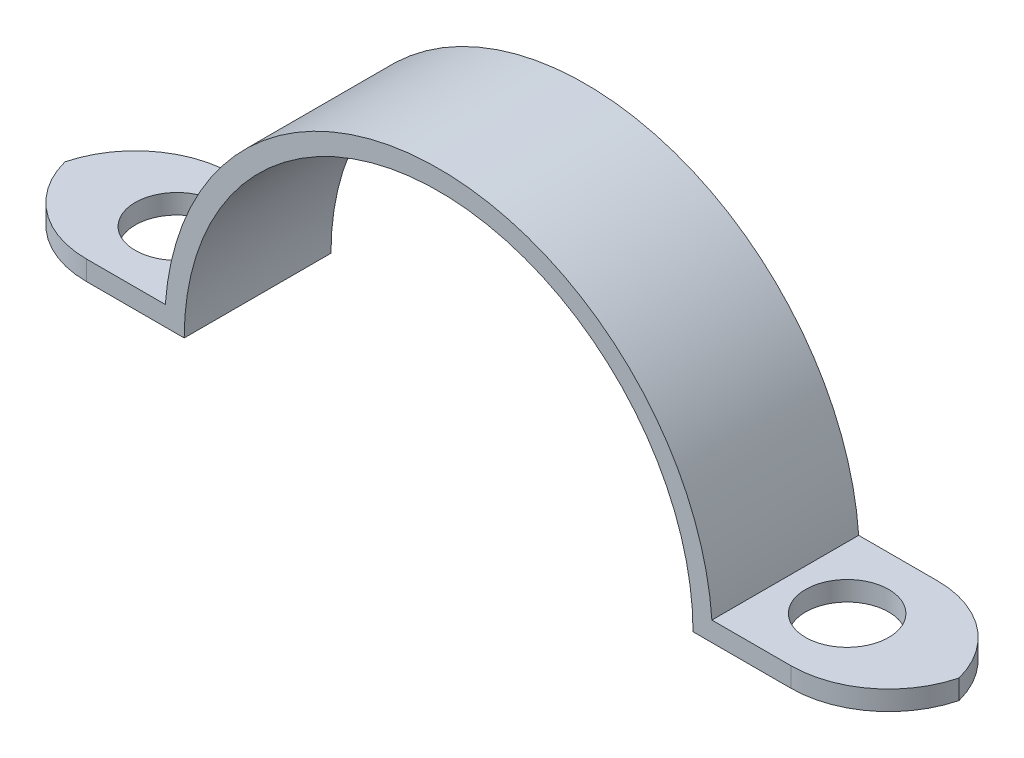
ISO-10303-21;
HEADER;
FILE_DESCRIPTION(('STEP AP214'),'2;1');
FILE_NAME('part.step','',(''),(''),'','','');
FILE_SCHEMA(('AUTOMOTIVE_DESIGN { 1 0 10303 214 1 1 1 1 }'));
ENDSEC;
DATA;
#1=APPLICATION_CONTEXT('core data for automotive mechanical design processes');
#2=APPLICATION_PROTOCOL_DEFINITION('international standard','automotive_design',2000,#1);
#3=PRODUCT_CONTEXT('',#1,'mechanical');
#4=PRODUCT('Part','Part','',(#3));
#5=PRODUCT_RELATED_PRODUCT_CATEGORY('part','',(#4));
#6=PRODUCT_DEFINITION_FORMATION('','',#4);
#7=PRODUCT_DEFINITION_CONTEXT('part definition',#1,'design');
#8=PRODUCT_DEFINITION('design','',#6,#7);
#9=PRODUCT_DEFINITION_SHAPE('','',#8);
#10=(LENGTH_UNIT() NAMED_UNIT(*) SI_UNIT(.MILLI.,.METRE.));
#11=(NAMED_UNIT(*) PLANE_ANGLE_UNIT() SI_UNIT($,.RADIAN.));
#12=(NAMED_UNIT(*) SI_UNIT($,.STERADIAN.) SOLID_ANGLE_UNIT());
#13=UNCERTAINTY_MEASURE_WITH_UNIT(LENGTH_MEASURE(1.E-05),#10,'distance_accuracy_value','');
#14=(GEOMETRIC_REPRESENTATION_CONTEXT(3) GLOBAL_UNCERTAINTY_ASSIGNED_CONTEXT((#13)) GLOBAL_UNIT_ASSIGNED_CONTEXT((#10,
#11,#12)) REPRESENTATION_CONTEXT('',''));
#15=CARTESIAN_POINT('',(0.,0.,0.));
#16=DIRECTION('',(0.,0.,1.));
#17=DIRECTION('',(1.,0.,0.));
#18=AXIS2_PLACEMENT_3D('',#15,#16,#17);
#19=CARTESIAN_POINT('',(26.,0.,-15.));
#20=DIRECTION('',(0.,-1.,0.));
#21=DIRECTION('',(1.,0.,0.));
#22=AXIS2_PLACEMENT_3D('',#19,#20,#21);
#23=PLANE('',#22);
#24=CARTESIAN_POINT('',(34.25,0.,-7.5));
#25=DIRECTION('',(0.,1.,0.));
#26=DIRECTION('',(-1.,0.,0.));
#27=AXIS2_PLACEMENT_3D('',#24,#25,#26);
#28=CIRCLE('',#27,4.25000000000001);
#29=CARTESIAN_POINT('',(30.,0.,-7.5));
#30=VERTEX_POINT('',#29);
#31=EDGE_CURVE('E232',#30,#30,#28,.T.);
#32=ORIENTED_EDGE('',*,*,#31,.T.);
#33=EDGE_LOOP('',(#32));
#34=FACE_BOUND('',#33,.T.);
#35=DIRECTION('',(1.,0.,0.));
#36=VECTOR('',#35,1.);
#37=CARTESIAN_POINT('',(26.,0.,-15.));
#38=LINE('',#37,#36);
#39=CARTESIAN_POINT('',(26.,0.,-15.));
#40=VERTEX_POINT('',#39);
#41=CARTESIAN_POINT('',(36.,0.,-15.));
#42=VERTEX_POINT('',#41);
#43=EDGE_CURVE('E149',#40,#42,#38,.T.);
#44=ORIENTED_EDGE('',*,*,#43,.T.);
#45=CARTESIAN_POINT('',(36.,0.,-5.));
#46=DIRECTION('',(0.,-1.,0.));
#47=DIRECTION('',(1.,0.,0.));
#48=AXIS2_PLACEMENT_3D('',#45,#46,#47);
#49=CIRCLE('',#48,10.);
#50=CARTESIAN_POINT('',(45.6824583655185,0.,-7.5));
#51=VERTEX_POINT('',#50);
#52=EDGE_CURVE('E65',#42,#51,#49,.T.);
#53=ORIENTED_EDGE('',*,*,#52,.T.);
#54=CARTESIAN_POINT('',(36.,0.,-10.));
#55=DIRECTION('',(0.,-1.,0.));
#56=DIRECTION('',(1.,0.,0.));
#57=AXIS2_PLACEMENT_3D('',#54,#55,#56);
#58=CIRCLE('',#57,10.);
#59=CARTESIAN_POINT('',(36.,0.,0.));
#60=VERTEX_POINT('',#59);
#61=EDGE_CURVE('E216',#51,#60,#58,.T.);
#62=ORIENTED_EDGE('',*,*,#61,.T.);
#63=DIRECTION('',(1.,0.,0.));
#64=VECTOR('',#63,1.);
#65=CARTESIAN_POINT('',(26.,0.,0.));
#66=LINE('',#65,#64);
#67=CARTESIAN_POINT('',(26.,0.,0.));
#68=VERTEX_POINT('',#67);
#69=EDGE_CURVE('E164',#68,#60,#66,.T.);
#70=ORIENTED_EDGE('',*,*,#69,.F.);
#71=DIRECTION('',(0.,0.,1.));
#72=VECTOR('',#71,1.);
#73=CARTESIAN_POINT('',(26.,0.,-15.));
#74=LINE('',#73,#72);
#75=EDGE_CURVE('E183',#40,#68,#74,.T.);
#76=ORIENTED_EDGE('',*,*,#75,.F.);
#77=EDGE_LOOP('',(#44,#53,#62,#70,#76));
#78=FACE_BOUND('',#77,.T.);
#79=ADVANCED_FACE('F41',(#34,#78),#23,.T.);
#80=CARTESIAN_POINT('',(0.,0.,-15.));
#81=DIRECTION('',(0.,0.,1.));
#82=DIRECTION('',(1.,0.,0.));
#83=AXIS2_PLACEMENT_3D('',#80,#81,#82);
#84=CYLINDRICAL_SURFACE('',#83,26.);
#85=CARTESIAN_POINT('',(0.,0.,0.));
#86=DIRECTION('',(0.,0.,-1.));
#87=DIRECTION('',(1.,0.,0.));
#88=AXIS2_PLACEMENT_3D('',#85,#86,#87);
#89=CIRCLE('',#88,26.);
#90=CARTESIAN_POINT('',(-26.,0.,0.));
#91=VERTEX_POINT('',#90);
#92=EDGE_CURVE('E152',#91,#68,#89,.T.);
#93=ORIENTED_EDGE('',*,*,#92,.F.);
#94=DIRECTION('',(0.,0.,1.));
#95=VECTOR('',#94,1.);
#96=CARTESIAN_POINT('',(-26.,0.,-15.));
#97=LINE('',#96,#95);
#98=CARTESIAN_POINT('',(-26.,0.,-15.));
#99=VERTEX_POINT('',#98);
#100=EDGE_CURVE('E187',#99,#91,#97,.T.);
#101=ORIENTED_EDGE('',*,*,#100,.F.);
#102=CARTESIAN_POINT('',(0.,0.,-15.));
#103=DIRECTION('',(0.,0.,-1.));
#104=DIRECTION('',(1.,0.,0.));
#105=AXIS2_PLACEMENT_3D('',#102,#103,#104);
#106=CIRCLE('',#105,26.);
#107=EDGE_CURVE('E144',#99,#40,#106,.T.);
#108=ORIENTED_EDGE('',*,*,#107,.T.);
#109=ORIENTED_EDGE('',*,*,#75,.T.);
#110=EDGE_LOOP('',(#93,#101,#108,#109));
#111=FACE_BOUND('',#110,.T.);
#112=ADVANCED_FACE('F246',(#111),#84,.F.);
#113=CARTESIAN_POINT('',(-26.,0.,-15.));
#114=DIRECTION('',(0.,-1.,0.));
#115=DIRECTION('',(1.,0.,0.));
#116=AXIS2_PLACEMENT_3D('',#113,#114,#115);
#117=PLANE('',#116);
#118=CARTESIAN_POINT('',(-34.25,0.,-7.5));
#119=DIRECTION('',(0.,1.,0.));
#120=DIRECTION('',(-1.,0.,0.));
#121=AXIS2_PLACEMENT_3D('',#118,#119,#120);
#122=CIRCLE('',#121,4.25);
#123=CARTESIAN_POINT('',(-38.5,0.,-7.5));
#124=VERTEX_POINT('',#123);
#125=EDGE_CURVE('E169',#124,#124,#122,.T.);
#126=ORIENTED_EDGE('',*,*,#125,.T.);
#127=EDGE_LOOP('',(#126));
#128=FACE_BOUND('',#127,.T.);
#129=CARTESIAN_POINT('',(-36.,0.,-10.));
#130=DIRECTION('',(0.,-1.,0.));
#131=DIRECTION('',(1.,0.,0.));
#132=AXIS2_PLACEMENT_3D('',#129,#130,#131);
#133=CIRCLE('',#132,10.);
#134=CARTESIAN_POINT('',(-36.,0.,0.));
#135=VERTEX_POINT('',#134);
#136=CARTESIAN_POINT('',(-45.6824583655185,0.,-7.5));
#137=VERTEX_POINT('',#136);
#138=EDGE_CURVE('E204',#135,#137,#133,.T.);
#139=ORIENTED_EDGE('',*,*,#138,.T.);
#140=CARTESIAN_POINT('',(-36.,0.,-5.));
#141=DIRECTION('',(0.,-1.,0.));
#142=DIRECTION('',(1.,0.,0.));
#143=AXIS2_PLACEMENT_3D('',#140,#141,#142);
#144=CIRCLE('',#143,10.);
#145=CARTESIAN_POINT('',(-36.,0.,-15.));
#146=VERTEX_POINT('',#145);
#147=EDGE_CURVE('E207',#137,#146,#144,.T.);
#148=ORIENTED_EDGE('',*,*,#147,.T.);
#149=DIRECTION('',(1.,0.,0.));
#150=VECTOR('',#149,1.);
#151=CARTESIAN_POINT('',(-26.,0.,-15.));
#152=LINE('',#151,#150);
#153=EDGE_CURVE('E158',#146,#99,#152,.T.);
#154=ORIENTED_EDGE('',*,*,#153,.T.);
#155=ORIENTED_EDGE('',*,*,#100,.T.);
#156=DIRECTION('',(1.,0.,0.));
#157=VECTOR('',#156,1.);
#158=CARTESIAN_POINT('',(-26.,0.,0.));
#159=LINE('',#158,#157);
#160=EDGE_CURVE('E177',#135,#91,#159,.T.);
#161=ORIENTED_EDGE('',*,*,#160,.F.);
#162=EDGE_LOOP('',(#139,#148,#154,#155,#161));
#163=FACE_BOUND('',#162,.T.);
#164=ADVANCED_FACE('F259',(#128,#163),#117,.T.);
#165=CARTESIAN_POINT('',(-26.,2.,-15.));
#166=DIRECTION('',(0.,-1.,0.));
#167=DIRECTION('',(1.,0.,0.));
#168=AXIS2_PLACEMENT_3D('',#165,#166,#167);
#169=PLANE('',#168);
#170=CARTESIAN_POINT('',(-34.25,2.,-7.5));
#171=DIRECTION('',(0.,1.,0.));
#172=DIRECTION('',(-1.,0.,0.));
#173=AXIS2_PLACEMENT_3D('',#170,#171,#172);
#174=CIRCLE('',#173,4.25);
#175=CARTESIAN_POINT('',(-38.5,2.,-7.5));
#176=VERTEX_POINT('',#175);
#177=EDGE_CURVE('E384',#176,#176,#174,.T.);
#178=ORIENTED_EDGE('',*,*,#177,.F.);
#179=EDGE_LOOP('',(#178));
#180=FACE_BOUND('',#179,.T.);
#181=DIRECTION('',(1.,0.,0.));
#182=VECTOR('',#181,1.);
#183=CARTESIAN_POINT('',(-26.,2.,-15.));
#184=LINE('',#183,#182);
#185=CARTESIAN_POINT('',(-36.,2.,-15.));
#186=VERTEX_POINT('',#185);
#187=CARTESIAN_POINT('',(-27.9284800875379,2.,-15.));
#188=VERTEX_POINT('',#187);
#189=EDGE_CURVE('E130',#186,#188,#184,.T.);
#190=ORIENTED_EDGE('',*,*,#189,.F.);
#191=CARTESIAN_POINT('',(-36.,2.,-5.));
#192=DIRECTION('',(0.,-1.,0.));
#193=DIRECTION('',(1.,0.,0.));
#194=AXIS2_PLACEMENT_3D('',#191,#192,#193);
#195=CIRCLE('',#194,10.);
#196=CARTESIAN_POINT('',(-45.6824583655185,2.,-7.5));
#197=VERTEX_POINT('',#196);
#198=EDGE_CURVE('E201',#186,#197,#195,.F.);
#199=ORIENTED_EDGE('',*,*,#198,.T.);
#200=CARTESIAN_POINT('',(-36.,2.,-10.));
#201=DIRECTION('',(0.,-1.,0.));
#202=DIRECTION('',(1.,0.,0.));
#203=AXIS2_PLACEMENT_3D('',#200,#201,#202);
#204=CIRCLE('',#203,10.);
#205=CARTESIAN_POINT('',(-36.,2.,0.));
#206=VERTEX_POINT('',#205);
#207=EDGE_CURVE('E198',#197,#206,#204,.F.);
#208=ORIENTED_EDGE('',*,*,#207,.T.);
#209=DIRECTION('',(1.,0.,0.));
#210=VECTOR('',#209,1.);
#211=CARTESIAN_POINT('',(-26.,2.,0.));
#212=LINE('',#211,#210);
#213=CARTESIAN_POINT('',(-27.9284800875379,2.,0.));
#214=VERTEX_POINT('',#213);
#215=EDGE_CURVE('E174',#206,#214,#212,.T.);
#216=ORIENTED_EDGE('',*,*,#215,.T.);
#217=DIRECTION('',(0.,0.,1.));
#218=VECTOR('',#217,1.);
#219=CARTESIAN_POINT('',(-27.9284800875379,2.,-15.));
#220=LINE('',#219,#218);
#221=EDGE_CURVE('E143',#188,#214,#220,.T.);
#222=ORIENTED_EDGE('',*,*,#221,.F.);
#223=EDGE_LOOP('',(#190,#199,#208,#216,#222));
#224=FACE_BOUND('',#223,.T.);
#225=ADVANCED_FACE('F254',(#180,#224),#169,.F.);
#226=CARTESIAN_POINT('',(0.,0.,-15.));
#227=DIRECTION('',(0.,0.,1.));
#228=DIRECTION('',(1.,0.,0.));
#229=AXIS2_PLACEMENT_3D('',#226,#227,#228);
#230=CYLINDRICAL_SURFACE('',#229,28.);
#231=CARTESIAN_POINT('',(0.,0.,0.));
#232=DIRECTION('',(0.,0.,1.));
#233=DIRECTION('',(1.,0.,0.));
#234=AXIS2_PLACEMENT_3D('',#231,#232,#233);
#235=CIRCLE('',#234,28.);
#236=CARTESIAN_POINT('',(27.9284800875379,2.,0.));
#237=VERTEX_POINT('',#236);
#238=EDGE_CURVE('E140',#214,#237,#235,.F.);
#239=ORIENTED_EDGE('',*,*,#238,.T.);
#240=DIRECTION('',(0.,0.,1.));
#241=VECTOR('',#240,1.);
#242=CARTESIAN_POINT('',(27.9284800875379,2.,-15.));
#243=LINE('',#242,#241);
#244=CARTESIAN_POINT('',(27.9284800875379,2.,-15.));
#245=VERTEX_POINT('',#244);
#246=EDGE_CURVE('E137',#245,#237,#243,.T.);
#247=ORIENTED_EDGE('',*,*,#246,.F.);
#248=CARTESIAN_POINT('',(0.,0.,-15.));
#249=DIRECTION('',(0.,0.,1.));
#250=DIRECTION('',(1.,0.,0.));
#251=AXIS2_PLACEMENT_3D('',#248,#249,#250);
#252=CIRCLE('',#251,28.);
#253=EDGE_CURVE('E120',#188,#245,#252,.F.);
#254=ORIENTED_EDGE('',*,*,#253,.F.);
#255=ORIENTED_EDGE('',*,*,#221,.T.);
#256=EDGE_LOOP('',(#239,#247,#254,#255));
#257=FACE_BOUND('',#256,.T.);
#258=ADVANCED_FACE('F138',(#257),#230,.T.);
#259=CARTESIAN_POINT('',(26.,2.,-15.));
#260=DIRECTION('',(0.,-1.,0.));
#261=DIRECTION('',(1.,0.,0.));
#262=AXIS2_PLACEMENT_3D('',#259,#260,#261);
#263=PLANE('',#262);
#264=CARTESIAN_POINT('',(34.25,2.00000000000001,-7.5));
#265=DIRECTION('',(0.,1.,0.));
#266=DIRECTION('',(-1.,0.,0.));
#267=AXIS2_PLACEMENT_3D('',#264,#265,#266);
#268=CIRCLE('',#267,4.25000000000001);
#269=CARTESIAN_POINT('',(30.,2.00000000000001,-7.5));
#270=VERTEX_POINT('',#269);
#271=EDGE_CURVE('E225',#270,#270,#268,.T.);
#272=ORIENTED_EDGE('',*,*,#271,.F.);
#273=EDGE_LOOP('',(#272));
#274=FACE_BOUND('',#273,.T.);
#275=CARTESIAN_POINT('',(36.,2.,-10.));
#276=DIRECTION('',(0.,-1.,0.));
#277=DIRECTION('',(1.,0.,0.));
#278=AXIS2_PLACEMENT_3D('',#275,#276,#277);
#279=CIRCLE('',#278,10.);
#280=CARTESIAN_POINT('',(36.,2.,0.));
#281=VERTEX_POINT('',#280);
#282=CARTESIAN_POINT('',(45.6824583655185,2.,-7.5));
#283=VERTEX_POINT('',#282);
#284=EDGE_CURVE('E51',#281,#283,#279,.F.);
#285=ORIENTED_EDGE('',*,*,#284,.T.);
#286=CARTESIAN_POINT('',(36.,2.,-5.));
#287=DIRECTION('',(0.,-1.,0.));
#288=DIRECTION('',(1.,0.,0.));
#289=AXIS2_PLACEMENT_3D('',#286,#287,#288);
#290=CIRCLE('',#289,10.);
#291=CARTESIAN_POINT('',(36.,2.,-15.));
#292=VERTEX_POINT('',#291);
#293=EDGE_CURVE('E11',#283,#292,#290,.F.);
#294=ORIENTED_EDGE('',*,*,#293,.T.);
#295=DIRECTION('',(1.,0.,0.));
#296=VECTOR('',#295,1.);
#297=CARTESIAN_POINT('',(26.,2.,-15.));
#298=LINE('',#297,#296);
#299=EDGE_CURVE('E126',#245,#292,#298,.T.);
#300=ORIENTED_EDGE('',*,*,#299,.F.);
#301=ORIENTED_EDGE('',*,*,#246,.T.);
#302=DIRECTION('',(1.,0.,0.));
#303=VECTOR('',#302,1.);
#304=CARTESIAN_POINT('',(26.,2.,0.));
#305=LINE('',#304,#303);
#306=EDGE_CURVE('E168',#237,#281,#305,.T.);
#307=ORIENTED_EDGE('',*,*,#306,.T.);
#308=EDGE_LOOP('',(#285,#294,#300,#301,#307));
#309=FACE_BOUND('',#308,.T.);
#310=ADVANCED_FACE('F146',(#274,#309),#263,.F.);
#311=CARTESIAN_POINT('',(0.,0.,-15.));
#312=DIRECTION('',(0.,0.,1.));
#313=DIRECTION('',(1.,0.,0.));
#314=AXIS2_PLACEMENT_3D('',#311,#312,#313);
#315=PLANE('',#314);
#316=ORIENTED_EDGE('',*,*,#153,.F.);
#317=DIRECTION('',(0.,1.,0.));
#318=VECTOR('',#317,1.);
#319=CARTESIAN_POINT('',(-36.,0.,-15.));
#320=LINE('',#319,#318);
#321=EDGE_CURVE('E195',#146,#186,#320,.T.);
#322=ORIENTED_EDGE('',*,*,#321,.T.);
#323=ORIENTED_EDGE('',*,*,#189,.T.);
#324=ORIENTED_EDGE('',*,*,#253,.T.);
#325=ORIENTED_EDGE('',*,*,#299,.T.);
#326=DIRECTION('',(0.,-1.,0.));
#327=VECTOR('',#326,1.);
#328=CARTESIAN_POINT('',(36.,0.,-15.));
#329=LINE('',#328,#327);
#330=EDGE_CURVE('E186',#292,#42,#329,.T.);
#331=ORIENTED_EDGE('',*,*,#330,.T.);
#332=ORIENTED_EDGE('',*,*,#43,.F.);
#333=ORIENTED_EDGE('',*,*,#107,.F.);
#334=EDGE_LOOP('',(#316,#322,#323,#324,#325,#331,#332,#333));
#335=FACE_BOUND('',#334,.T.);
#336=ADVANCED_FACE('F123',(#335),#315,.F.);
#337=CARTESIAN_POINT('',(0.,0.,0.));
#338=DIRECTION('',(0.,0.,1.));
#339=DIRECTION('',(1.,0.,0.));
#340=AXIS2_PLACEMENT_3D('',#337,#338,#339);
#341=PLANE('',#340);
#342=ORIENTED_EDGE('',*,*,#215,.F.);
#343=DIRECTION('',(0.,1.,0.));
#344=VECTOR('',#343,1.);
#345=CARTESIAN_POINT('',(-36.,0.,0.));
#346=LINE('',#345,#344);
#347=EDGE_CURVE('E213',#206,#135,#346,.F.);
#348=ORIENTED_EDGE('',*,*,#347,.T.);
#349=ORIENTED_EDGE('',*,*,#160,.T.);
#350=ORIENTED_EDGE('',*,*,#92,.T.);
#351=ORIENTED_EDGE('',*,*,#69,.T.);
#352=DIRECTION('',(0.,-1.,0.));
#353=VECTOR('',#352,1.);
#354=CARTESIAN_POINT('',(36.,2.,0.));
#355=LINE('',#354,#353);
#356=EDGE_CURVE('E210',#60,#281,#355,.F.);
#357=ORIENTED_EDGE('',*,*,#356,.T.);
#358=ORIENTED_EDGE('',*,*,#306,.F.);
#359=ORIENTED_EDGE('',*,*,#238,.F.);
#360=EDGE_LOOP('',(#342,#348,#349,#350,#351,#357,#358,#359));
#361=FACE_BOUND('',#360,.T.);
#362=ADVANCED_FACE('F241',(#361),#341,.T.);
#363=CARTESIAN_POINT('',(34.25,0.,-7.5));
#364=DIRECTION('',(0.,1.,0.));
#365=DIRECTION('',(-1.,0.,0.));
#366=AXIS2_PLACEMENT_3D('',#363,#364,#365);
#367=CYLINDRICAL_SURFACE('',#366,4.25000000000001);
#368=ORIENTED_EDGE('',*,*,#31,.F.);
#369=EDGE_LOOP('',(#368));
#370=FACE_BOUND('',#369,.T.);
#371=ORIENTED_EDGE('',*,*,#271,.T.);
#372=EDGE_LOOP('',(#371));
#373=FACE_BOUND('',#372,.T.);
#374=ADVANCED_FACE('F305',(#370,#373),#367,.F.);
#375=CARTESIAN_POINT('',(-34.25,0.,-7.5));
#376=DIRECTION('',(0.,1.,0.));
#377=DIRECTION('',(-1.,0.,0.));
#378=AXIS2_PLACEMENT_3D('',#375,#376,#377);
#379=CYLINDRICAL_SURFACE('',#378,4.25);
#380=ORIENTED_EDGE('',*,*,#125,.F.);
#381=EDGE_LOOP('',(#380));
#382=FACE_BOUND('',#381,.T.);
#383=ORIENTED_EDGE('',*,*,#177,.T.);
#384=EDGE_LOOP('',(#383));
#385=FACE_BOUND('',#384,.T.);
#386=ADVANCED_FACE('F283',(#382,#385),#379,.F.);
#387=CARTESIAN_POINT('',(-36.,0.,-10.));
#388=DIRECTION('',(0.,-1.,0.));
#389=DIRECTION('',(0.,0.,-1.));
#390=AXIS2_PLACEMENT_3D('',#387,#388,#389);
#391=CYLINDRICAL_SURFACE('',#390,10.);
#392=DIRECTION('',(0.,-1.,0.));
#393=VECTOR('',#392,1.);
#394=CARTESIAN_POINT('',(-45.6824583655185,0.999999999999997,-7.5));
#395=LINE('',#394,#393);
#396=EDGE_CURVE('E222',#137,#197,#395,.F.);
#397=ORIENTED_EDGE('',*,*,#396,.F.);
#398=ORIENTED_EDGE('',*,*,#138,.F.);
#399=ORIENTED_EDGE('',*,*,#347,.F.);
#400=ORIENTED_EDGE('',*,*,#207,.F.);
#401=EDGE_LOOP('',(#397,#398,#399,#400));
#402=FACE_BOUND('',#401,.T.);
#403=ADVANCED_FACE('F257',(#402),#391,.T.);
#404=CARTESIAN_POINT('',(-36.,0.,-5.));
#405=DIRECTION('',(0.,1.,0.));
#406=DIRECTION('',(0.,0.,1.));
#407=AXIS2_PLACEMENT_3D('',#404,#405,#406);
#408=CYLINDRICAL_SURFACE('',#407,10.);
#409=ORIENTED_EDGE('',*,*,#147,.F.);
#410=ORIENTED_EDGE('',*,*,#396,.T.);
#411=ORIENTED_EDGE('',*,*,#198,.F.);
#412=ORIENTED_EDGE('',*,*,#321,.F.);
#413=EDGE_LOOP('',(#409,#410,#411,#412));
#414=FACE_BOUND('',#413,.T.);
#415=ADVANCED_FACE('F251',(#414),#408,.T.);
#416=CARTESIAN_POINT('',(36.,2.,-10.));
#417=DIRECTION('',(0.,1.,0.));
#418=DIRECTION('',(0.,0.,1.));
#419=AXIS2_PLACEMENT_3D('',#416,#417,#418);
#420=CYLINDRICAL_SURFACE('',#419,10.);
#421=DIRECTION('',(0.,1.,0.));
#422=VECTOR('',#421,1.);
#423=CARTESIAN_POINT('',(45.6824583655185,1.,-7.5));
#424=LINE('',#423,#422);
#425=EDGE_CURVE('E45',#283,#51,#424,.F.);
#426=ORIENTED_EDGE('',*,*,#425,.F.);
#427=ORIENTED_EDGE('',*,*,#284,.F.);
#428=ORIENTED_EDGE('',*,*,#356,.F.);
#429=ORIENTED_EDGE('',*,*,#61,.F.);
#430=EDGE_LOOP('',(#426,#427,#428,#429));
#431=FACE_BOUND('',#430,.T.);
#432=ADVANCED_FACE('F43',(#431),#420,.T.);
#433=CARTESIAN_POINT('',(36.,0.,-5.));
#434=DIRECTION('',(0.,-1.,0.));
#435=DIRECTION('',(0.,0.,-1.));
#436=AXIS2_PLACEMENT_3D('',#433,#434,#435);
#437=CYLINDRICAL_SURFACE('',#436,10.);
#438=ORIENTED_EDGE('',*,*,#293,.F.);
#439=ORIENTED_EDGE('',*,*,#425,.T.);
#440=ORIENTED_EDGE('',*,*,#52,.F.);
#441=ORIENTED_EDGE('',*,*,#330,.F.);
#442=EDGE_LOOP('',(#438,#439,#440,#441));
#443=FACE_BOUND('',#442,.T.);
#444=ADVANCED_FACE('F235',(#443),#437,.T.);
#445=CLOSED_SHELL('',(#79,#112,#164,#225,#258,#310,#336,#362,#374,#386,#403,#415,#432,#444));
#446=MANIFOLD_SOLID_BREP('B2',#445);
#447=ADVANCED_BREP_SHAPE_REPRESENTATION('',(#18,#446),#14);
#448=SHAPE_DEFINITION_REPRESENTATION(#9,#447);
ENDSEC;
END-ISO-10303-21;
